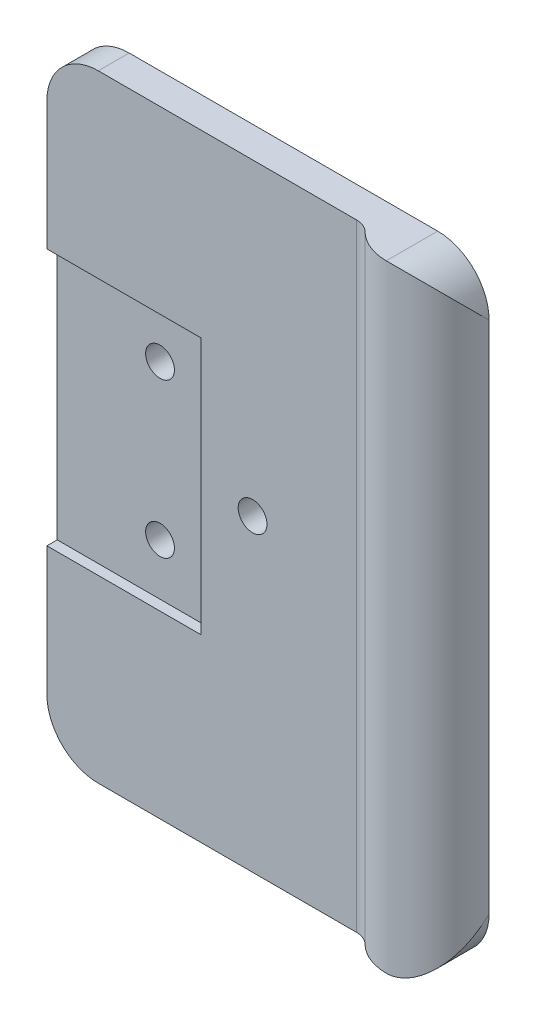
ISO-10303-21;
HEADER;
FILE_DESCRIPTION(('STEP AP214'),'2;1');
FILE_NAME('part.step','',(''),(''),'','','');
FILE_SCHEMA(('AUTOMOTIVE_DESIGN { 1 0 10303 214 1 1 1 1 }'));
ENDSEC;
DATA;
#1=APPLICATION_CONTEXT('core data for automotive mechanical design processes');
#2=APPLICATION_PROTOCOL_DEFINITION('international standard','automotive_design',2000,#1);
#3=PRODUCT_CONTEXT('',#1,'mechanical');
#4=PRODUCT('Part','Part','',(#3));
#5=PRODUCT_RELATED_PRODUCT_CATEGORY('part','',(#4));
#6=PRODUCT_DEFINITION_FORMATION('','',#4);
#7=PRODUCT_DEFINITION_CONTEXT('part definition',#1,'design');
#8=PRODUCT_DEFINITION('design','',#6,#7);
#9=PRODUCT_DEFINITION_SHAPE('','',#8);
#10=(LENGTH_UNIT() NAMED_UNIT(*) SI_UNIT(.MILLI.,.METRE.));
#11=(NAMED_UNIT(*) PLANE_ANGLE_UNIT() SI_UNIT($,.RADIAN.));
#12=(NAMED_UNIT(*) SI_UNIT($,.STERADIAN.) SOLID_ANGLE_UNIT());
#13=UNCERTAINTY_MEASURE_WITH_UNIT(LENGTH_MEASURE(1.E-05),#10,'distance_accuracy_value','');
#14=(GEOMETRIC_REPRESENTATION_CONTEXT(3) GLOBAL_UNCERTAINTY_ASSIGNED_CONTEXT((#13)) GLOBAL_UNIT_ASSIGNED_CONTEXT((#10,
#11,#12)) REPRESENTATION_CONTEXT('',''));
#15=CARTESIAN_POINT('',(0.,0.,0.));
#16=DIRECTION('',(0.,0.,1.));
#17=DIRECTION('',(1.,0.,0.));
#18=AXIS2_PLACEMENT_3D('',#15,#16,#17);
#19=CARTESIAN_POINT('',(0.,0.,-3.));
#20=DIRECTION('',(0.,0.,-1.));
#21=DIRECTION('',(-1.,0.,0.));
#22=AXIS2_PLACEMENT_3D('',#19,#20,#21);
#23=PLANE('',#22);
#24=CARTESIAN_POINT('',(-55.9850692997892,4.30643440303937,-3.));
#25=DIRECTION('',(0.,0.,1.));
#26=DIRECTION('',(1.,0.,0.));
#27=AXIS2_PLACEMENT_3D('',#24,#25,#26);
#28=CIRCLE('',#27,1.4);
#29=CARTESIAN_POINT('',(-54.5850692997892,4.30643440303937,-3.));
#30=VERTEX_POINT('',#29);
#31=EDGE_CURVE('E165',#30,#30,#28,.T.);
#32=ORIENTED_EDGE('',*,*,#31,.T.);
#33=EDGE_LOOP('',(#32));
#34=FACE_BOUND('',#33,.T.);
#35=CARTESIAN_POINT('',(-55.9850692997892,-10.6935655969606,-3.));
#36=DIRECTION('',(0.,0.,1.));
#37=DIRECTION('',(1.,0.,0.));
#38=AXIS2_PLACEMENT_3D('',#35,#36,#37);
#39=CIRCLE('',#38,1.4);
#40=CARTESIAN_POINT('',(-54.5850692997892,-10.6935655969606,-3.));
#41=VERTEX_POINT('',#40);
#42=EDGE_CURVE('E171',#41,#41,#39,.T.);
#43=ORIENTED_EDGE('',*,*,#42,.T.);
#44=EDGE_LOOP('',(#43));
#45=FACE_BOUND('',#44,.T.);
#46=CARTESIAN_POINT('',(-45.9850692997892,-3.19356559696063,-3.));
#47=DIRECTION('',(0.,0.,1.));
#48=DIRECTION('',(1.,0.,0.));
#49=AXIS2_PLACEMENT_3D('',#46,#47,#48);
#50=CIRCLE('',#49,1.4);
#51=CARTESIAN_POINT('',(-44.5850692997892,-3.19356559696063,-3.));
#52=VERTEX_POINT('',#51);
#53=EDGE_CURVE('E177',#52,#52,#50,.T.);
#54=ORIENTED_EDGE('',*,*,#53,.T.);
#55=EDGE_LOOP('',(#54));
#56=FACE_BOUND('',#55,.T.);
#57=DIRECTION('',(1.,0.,0.));
#58=VECTOR('',#57,1.);
#59=CARTESIAN_POINT('',(-65.9850692997892,26.8064344030394,-3.));
#60=LINE('',#59,#58);
#61=CARTESIAN_POINT('',(-60.9850692997892,26.8064344030394,-3.));
#62=VERTEX_POINT('',#61);
#63=CARTESIAN_POINT('',(-30.9850692997892,26.8064344030394,-3.));
#64=VERTEX_POINT('',#63);
#65=EDGE_CURVE('E131',#62,#64,#60,.T.);
#66=ORIENTED_EDGE('',*,*,#65,.T.);
#67=CARTESIAN_POINT('',(-30.9850692997892,21.8064344030393,-3.));
#68=DIRECTION('',(0.,0.,-1.));
#69=DIRECTION('',(1.,0.,0.));
#70=AXIS2_PLACEMENT_3D('',#67,#68,#69);
#71=CIRCLE('',#70,5.);
#72=CARTESIAN_POINT('',(-25.9850692997892,21.8064344030393,-3.));
#73=VERTEX_POINT('',#72);
#74=EDGE_CURVE('E135',#64,#73,#71,.T.);
#75=ORIENTED_EDGE('',*,*,#74,.T.);
#76=DIRECTION('',(0.,-1.,0.));
#77=VECTOR('',#76,1.);
#78=CARTESIAN_POINT('',(-25.9850692997892,26.8064344030394,-3.));
#79=LINE('',#78,#77);
#80=CARTESIAN_POINT('',(-25.9850692997892,-28.1935655969606,-3.));
#81=VERTEX_POINT('',#80);
#82=EDGE_CURVE('E141',#73,#81,#79,.T.);
#83=ORIENTED_EDGE('',*,*,#82,.T.);
#84=CARTESIAN_POINT('',(-30.9850692997892,-28.1935655969606,-3.));
#85=DIRECTION('',(0.,0.,-1.));
#86=DIRECTION('',(1.,0.,0.));
#87=AXIS2_PLACEMENT_3D('',#84,#85,#86);
#88=CIRCLE('',#87,5.);
#89=CARTESIAN_POINT('',(-30.9850692997893,-33.1935655969606,-3.));
#90=VERTEX_POINT('',#89);
#91=EDGE_CURVE('E152',#81,#90,#88,.T.);
#92=ORIENTED_EDGE('',*,*,#91,.T.);
#93=DIRECTION('',(-1.,0.,0.));
#94=VECTOR('',#93,1.);
#95=CARTESIAN_POINT('',(-25.9850692997892,-33.1935655969606,-3.));
#96=LINE('',#95,#94);
#97=CARTESIAN_POINT('',(-60.9850692997892,-33.1935655969606,-3.));
#98=VERTEX_POINT('',#97);
#99=EDGE_CURVE('E220',#90,#98,#96,.T.);
#100=ORIENTED_EDGE('',*,*,#99,.T.);
#101=CARTESIAN_POINT('',(-60.9850692997892,-28.1935655969606,-3.));
#102=DIRECTION('',(0.,0.,-1.));
#103=DIRECTION('',(-1.,0.,0.));
#104=AXIS2_PLACEMENT_3D('',#101,#102,#103);
#105=CIRCLE('',#104,5.);
#106=CARTESIAN_POINT('',(-65.9850692997892,-28.1935655969606,-3.));
#107=VERTEX_POINT('',#106);
#108=EDGE_CURVE('E226',#98,#107,#105,.T.);
#109=ORIENTED_EDGE('',*,*,#108,.T.);
#110=DIRECTION('',(0.,1.,0.));
#111=VECTOR('',#110,1.);
#112=CARTESIAN_POINT('',(-65.9850692997892,-33.1935655969606,-3.));
#113=LINE('',#112,#111);
#114=CARTESIAN_POINT('',(-65.9850692997892,21.8064344030393,-3.));
#115=VERTEX_POINT('',#114);
#116=EDGE_CURVE('E142',#107,#115,#113,.T.);
#117=ORIENTED_EDGE('',*,*,#116,.T.);
#118=CARTESIAN_POINT('',(-60.9850692997892,21.8064344030393,-3.));
#119=DIRECTION('',(0.,0.,-1.));
#120=DIRECTION('',(-1.,0.,0.));
#121=AXIS2_PLACEMENT_3D('',#118,#119,#120);
#122=CIRCLE('',#121,5.);
#123=EDGE_CURVE('E138',#115,#62,#122,.T.);
#124=ORIENTED_EDGE('',*,*,#123,.T.);
#125=EDGE_LOOP('',(#66,#75,#83,#92,#100,#109,#117,#124));
#126=FACE_BOUND('',#125,.T.);
#127=ADVANCED_FACE('F37',(#34,#45,#56,#126),#23,.T.);
#128=CARTESIAN_POINT('',(-30.9850692997892,36.5,-3.));
#129=DIRECTION('',(0.,-1.,0.));
#130=DIRECTION('',(0.,0.,-1.));
#131=AXIS2_PLACEMENT_3D('',#128,#129,#130);
#132=CYLINDRICAL_SURFACE('',#131,5.);
#133=CARTESIAN_POINT('',(-30.9850692997892,26.8064344030394,-3.));
#134=DIRECTION('',(0.,1.,0.));
#135=DIRECTION('',(0.,0.,1.));
#136=AXIS2_PLACEMENT_3D('',#133,#134,#135);
#137=CIRCLE('',#136,5.);
#138=CARTESIAN_POINT('',(-34.4843403609081,26.8064344030394,0.571428571428572));
#139=VERTEX_POINT('',#138);
#140=CARTESIAN_POINT('',(-30.9850692997892,26.8064344030394,2.));
#141=VERTEX_POINT('',#140);
#142=EDGE_CURVE('E148',#139,#141,#137,.T.);
#143=ORIENTED_EDGE('',*,*,#142,.F.);
#144=DIRECTION('',(0.,-1.,0.));
#145=VECTOR('',#144,1.);
#146=CARTESIAN_POINT('',(-34.4843403609081,36.5,0.571428571428572));
#147=LINE('',#146,#145);
#148=CARTESIAN_POINT('',(-34.4843403609081,-33.1935655969606,0.571428571428572));
#149=VERTEX_POINT('',#148);
#150=EDGE_CURVE('E245',#139,#149,#147,.T.);
#151=ORIENTED_EDGE('',*,*,#150,.T.);
#152=CARTESIAN_POINT('',(-30.9850692997892,-33.1935655969606,-3.));
#153=DIRECTION('',(0.,-1.,0.));
#154=DIRECTION('',(0.,0.,-1.));
#155=AXIS2_PLACEMENT_3D('',#152,#153,#154);
#156=CIRCLE('',#155,5.);
#157=CARTESIAN_POINT('',(-30.9850692997893,-33.1935655969606,2.));
#158=VERTEX_POINT('',#157);
#159=EDGE_CURVE('E239',#158,#149,#156,.T.);
#160=ORIENTED_EDGE('',*,*,#159,.F.);
#161=CARTESIAN_POINT('',(-30.9850692997892,-28.1935655969606,-3.));
#162=DIRECTION('',(0.,-0.707106781186547,-0.707106781186547));
#163=DIRECTION('',(0.,-0.707106781186547,0.707106781186547));
#164=AXIS2_PLACEMENT_3D('',#161,#162,#163);
#165=ELLIPSE('',#164,7.07106781186547,5.);
#166=EDGE_CURVE('E241',#81,#158,#165,.T.);
#167=ORIENTED_EDGE('',*,*,#166,.F.);
#168=ORIENTED_EDGE('',*,*,#82,.F.);
#169=CARTESIAN_POINT('',(-30.9850692997892,21.8064344030393,-3.));
#170=DIRECTION('',(0.,-0.707106781186547,0.707106781186547));
#171=DIRECTION('',(0.,-0.707106781186547,-0.707106781186547));
#172=AXIS2_PLACEMENT_3D('',#169,#170,#171);
#173=ELLIPSE('',#172,7.07106781186548,5.);
#174=EDGE_CURVE('E155',#141,#73,#173,.F.);
#175=ORIENTED_EDGE('',*,*,#174,.F.);
#176=EDGE_LOOP('',(#143,#151,#160,#167,#168,#175));
#177=FACE_BOUND('',#176,.T.);
#178=ADVANCED_FACE('F251',(#177),#132,.T.);
#179=CARTESIAN_POINT('',(-25.9850692997892,-33.1935655969606,0.));
#180=DIRECTION('',(0.,-1.,0.));
#181=DIRECTION('',(0.,0.,-1.));
#182=AXIS2_PLACEMENT_3D('',#179,#180,#181);
#183=PLANE('',#182);
#184=ORIENTED_EDGE('',*,*,#99,.F.);
#185=DIRECTION('',(0.,0.,-1.));
#186=VECTOR('',#185,1.);
#187=CARTESIAN_POINT('',(-30.9850692997893,-33.1935655969606,123.));
#188=LINE('',#187,#186);
#189=EDGE_CURVE('E151',#158,#90,#188,.T.);
#190=ORIENTED_EDGE('',*,*,#189,.F.);
#191=ORIENTED_EDGE('',*,*,#159,.T.);
#192=CARTESIAN_POINT('',(-35.8840487853556,-33.1935655969606,2.));
#193=DIRECTION('',(0.,-1.,0.));
#194=DIRECTION('',(0.,0.,-1.));
#195=AXIS2_PLACEMENT_3D('',#192,#193,#194);
#196=CIRCLE('',#195,2.);
#197=CARTESIAN_POINT('',(-35.8840487853556,-33.1935655969606,0.));
#198=VERTEX_POINT('',#197);
#199=EDGE_CURVE('E45',#149,#198,#196,.F.);
#200=ORIENTED_EDGE('',*,*,#199,.T.);
#201=DIRECTION('',(-1.,0.,0.));
#202=VECTOR('',#201,1.);
#203=CARTESIAN_POINT('',(-25.9850692997892,-33.1935655969606,0.));
#204=LINE('',#203,#202);
#205=CARTESIAN_POINT('',(-60.9850692997892,-33.1935655969606,0.));
#206=VERTEX_POINT('',#205);
#207=EDGE_CURVE('E215',#198,#206,#204,.T.);
#208=ORIENTED_EDGE('',*,*,#207,.T.);
#209=DIRECTION('',(0.,0.,-1.));
#210=VECTOR('',#209,1.);
#211=CARTESIAN_POINT('',(-60.9850692997892,-33.1935655969606,0.));
#212=LINE('',#211,#210);
#213=EDGE_CURVE('E236',#206,#98,#212,.T.);
#214=ORIENTED_EDGE('',*,*,#213,.T.);
#215=EDGE_LOOP('',(#184,#190,#191,#200,#208,#214));
#216=FACE_BOUND('',#215,.T.);
#217=ADVANCED_FACE('F256',(#216),#183,.T.);
#218=CARTESIAN_POINT('',(-65.9850692997892,26.8064344030394,0.));
#219=DIRECTION('',(0.,1.,0.));
#220=DIRECTION('',(0.,0.,1.));
#221=AXIS2_PLACEMENT_3D('',#218,#219,#220);
#222=PLANE('',#221);
#223=DIRECTION('',(1.,0.,0.));
#224=VECTOR('',#223,1.);
#225=CARTESIAN_POINT('',(-65.9850692997892,26.8064344030394,0.));
#226=LINE('',#225,#224);
#227=CARTESIAN_POINT('',(-60.9850692997892,26.8064344030394,0.));
#228=VERTEX_POINT('',#227);
#229=CARTESIAN_POINT('',(-35.8840487853556,26.8064344030394,0.));
#230=VERTEX_POINT('',#229);
#231=EDGE_CURVE('E212',#228,#230,#226,.T.);
#232=ORIENTED_EDGE('',*,*,#231,.T.);
#233=CARTESIAN_POINT('',(-35.8840487853556,26.8064344030394,2.));
#234=DIRECTION('',(0.,1.,0.));
#235=DIRECTION('',(0.,0.,1.));
#236=AXIS2_PLACEMENT_3D('',#233,#234,#235);
#237=CIRCLE('',#236,2.);
#238=EDGE_CURVE('E11',#230,#139,#237,.F.);
#239=ORIENTED_EDGE('',*,*,#238,.T.);
#240=ORIENTED_EDGE('',*,*,#142,.T.);
#241=DIRECTION('',(0.,0.,-1.));
#242=VECTOR('',#241,1.);
#243=CARTESIAN_POINT('',(-30.9850692997892,26.8064344030394,123.));
#244=LINE('',#243,#242);
#245=EDGE_CURVE('E145',#141,#64,#244,.T.);
#246=ORIENTED_EDGE('',*,*,#245,.T.);
#247=ORIENTED_EDGE('',*,*,#65,.F.);
#248=DIRECTION('',(0.,0.,-1.));
#249=VECTOR('',#248,1.);
#250=CARTESIAN_POINT('',(-60.9850692997892,26.8064344030394,0.));
#251=LINE('',#250,#249);
#252=EDGE_CURVE('E229',#62,#228,#251,.F.);
#253=ORIENTED_EDGE('',*,*,#252,.T.);
#254=EDGE_LOOP('',(#232,#239,#240,#246,#247,#253));
#255=FACE_BOUND('',#254,.T.);
#256=ADVANCED_FACE('F146',(#255),#222,.T.);
#257=CARTESIAN_POINT('',(0.,0.,0.));
#258=DIRECTION('',(0.,0.,-1.));
#259=DIRECTION('',(-1.,0.,0.));
#260=AXIS2_PLACEMENT_3D('',#257,#258,#259);
#261=PLANE('',#260);
#262=CARTESIAN_POINT('',(-45.9850692997892,-3.19356559696063,0.));
#263=DIRECTION('',(0.,0.,1.));
#264=DIRECTION('',(1.,0.,0.));
#265=AXIS2_PLACEMENT_3D('',#262,#263,#264);
#266=CIRCLE('',#265,1.4);
#267=CARTESIAN_POINT('',(-44.5850692997892,-3.19356559696063,0.));
#268=VERTEX_POINT('',#267);
#269=EDGE_CURVE('E174',#268,#268,#266,.T.);
#270=ORIENTED_EDGE('',*,*,#269,.F.);
#271=EDGE_LOOP('',(#270));
#272=FACE_BOUND('',#271,.T.);
#273=ORIENTED_EDGE('',*,*,#207,.F.);
#274=DIRECTION('',(0.,1.,0.));
#275=VECTOR('',#274,1.);
#276=CARTESIAN_POINT('',(-35.8840487853556,26.8064344030394,0.));
#277=LINE('',#276,#275);
#278=EDGE_CURVE('E58',#198,#230,#277,.T.);
#279=ORIENTED_EDGE('',*,*,#278,.T.);
#280=ORIENTED_EDGE('',*,*,#231,.F.);
#281=CARTESIAN_POINT('',(-60.9850692997892,21.8064344030393,0.));
#282=DIRECTION('',(0.,0.,-1.));
#283=DIRECTION('',(-1.,0.,0.));
#284=AXIS2_PLACEMENT_3D('',#281,#282,#283);
#285=CIRCLE('',#284,5.);
#286=CARTESIAN_POINT('',(-65.9850692997892,21.8064344030393,0.));
#287=VERTEX_POINT('',#286);
#288=EDGE_CURVE('E234',#228,#287,#285,.F.);
#289=ORIENTED_EDGE('',*,*,#288,.T.);
#290=DIRECTION('',(0.,1.,0.));
#291=VECTOR('',#290,1.);
#292=CARTESIAN_POINT('',(-65.9850692997892,-33.1935655969606,0.));
#293=LINE('',#292,#291);
#294=CARTESIAN_POINT('',(-65.9850692997892,9.30643440303937,0.));
#295=VERTEX_POINT('',#294);
#296=EDGE_CURVE('E213',#295,#287,#293,.T.);
#297=ORIENTED_EDGE('',*,*,#296,.F.);
#298=DIRECTION('',(-1.,0.,0.));
#299=VECTOR('',#298,1.);
#300=CARTESIAN_POINT('',(-50.9850692997892,9.30643440303937,0.));
#301=LINE('',#300,#299);
#302=CARTESIAN_POINT('',(-50.9850692997892,9.30643440303937,0.));
#303=VERTEX_POINT('',#302);
#304=EDGE_CURVE('E185',#303,#295,#301,.T.);
#305=ORIENTED_EDGE('',*,*,#304,.F.);
#306=DIRECTION('',(0.,1.,0.));
#307=VECTOR('',#306,1.);
#308=CARTESIAN_POINT('',(-50.9850692997892,-15.6935655969607,0.));
#309=LINE('',#308,#307);
#310=CARTESIAN_POINT('',(-50.9850692997892,-15.6935655969607,0.));
#311=VERTEX_POINT('',#310);
#312=EDGE_CURVE('E197',#311,#303,#309,.T.);
#313=ORIENTED_EDGE('',*,*,#312,.F.);
#314=DIRECTION('',(1.,0.,0.));
#315=VECTOR('',#314,1.);
#316=CARTESIAN_POINT('',(-65.9850692997892,-15.6935655969607,0.));
#317=LINE('',#316,#315);
#318=CARTESIAN_POINT('',(-65.9850692997892,-15.6935655969607,0.));
#319=VERTEX_POINT('',#318);
#320=EDGE_CURVE('E180',#319,#311,#317,.T.);
#321=ORIENTED_EDGE('',*,*,#320,.F.);
#322=CARTESIAN_POINT('',(-65.9850692997892,-28.1935655969606,0.));
#323=VERTEX_POINT('',#322);
#324=EDGE_CURVE('E210',#323,#319,#293,.T.);
#325=ORIENTED_EDGE('',*,*,#324,.F.);
#326=CARTESIAN_POINT('',(-60.9850692997892,-28.1935655969606,0.));
#327=DIRECTION('',(0.,0.,-1.));
#328=DIRECTION('',(-1.,0.,0.));
#329=AXIS2_PLACEMENT_3D('',#326,#327,#328);
#330=CIRCLE('',#329,5.);
#331=EDGE_CURVE('E231',#323,#206,#330,.F.);
#332=ORIENTED_EDGE('',*,*,#331,.T.);
#333=EDGE_LOOP('',(#273,#279,#280,#289,#297,#305,#313,#321,#325,#332));
#334=FACE_BOUND('',#333,.T.);
#335=ADVANCED_FACE('F267',(#272,#334),#261,.F.);
#336=CARTESIAN_POINT('',(-65.9850692997892,-33.1935655969606,0.));
#337=DIRECTION('',(-1.,0.,0.));
#338=DIRECTION('',(0.,-1.,0.));
#339=AXIS2_PLACEMENT_3D('',#336,#337,#338);
#340=PLANE('',#339);
#341=ORIENTED_EDGE('',*,*,#296,.T.);
#342=DIRECTION('',(0.,0.,-1.));
#343=VECTOR('',#342,1.);
#344=CARTESIAN_POINT('',(-65.9850692997892,21.8064344030393,0.));
#345=LINE('',#344,#343);
#346=EDGE_CURVE('E223',#287,#115,#345,.T.);
#347=ORIENTED_EDGE('',*,*,#346,.T.);
#348=ORIENTED_EDGE('',*,*,#116,.F.);
#349=DIRECTION('',(0.,0.,-1.));
#350=VECTOR('',#349,1.);
#351=CARTESIAN_POINT('',(-65.9850692997892,-28.1935655969606,0.));
#352=LINE('',#351,#350);
#353=EDGE_CURVE('E217',#107,#323,#352,.F.);
#354=ORIENTED_EDGE('',*,*,#353,.T.);
#355=ORIENTED_EDGE('',*,*,#324,.T.);
#356=DIRECTION('',(0.,0.,1.));
#357=VECTOR('',#356,1.);
#358=CARTESIAN_POINT('',(-65.9850692997892,-15.6935655969607,-1.));
#359=LINE('',#358,#357);
#360=CARTESIAN_POINT('',(-65.9850692997892,-15.6935655969607,-1.));
#361=VERTEX_POINT('',#360);
#362=EDGE_CURVE('E194',#361,#319,#359,.T.);
#363=ORIENTED_EDGE('',*,*,#362,.F.);
#364=DIRECTION('',(0.,-1.,0.));
#365=VECTOR('',#364,1.);
#366=CARTESIAN_POINT('',(-65.9850692997892,9.30643440303937,-1.));
#367=LINE('',#366,#365);
#368=CARTESIAN_POINT('',(-65.9850692997892,9.30643440303937,-1.));
#369=VERTEX_POINT('',#368);
#370=EDGE_CURVE('E181',#369,#361,#367,.T.);
#371=ORIENTED_EDGE('',*,*,#370,.F.);
#372=DIRECTION('',(0.,0.,1.));
#373=VECTOR('',#372,1.);
#374=CARTESIAN_POINT('',(-65.9850692997892,9.30643440303937,-1.));
#375=LINE('',#374,#373);
#376=EDGE_CURVE('E201',#369,#295,#375,.T.);
#377=ORIENTED_EDGE('',*,*,#376,.T.);
#378=EDGE_LOOP('',(#341,#347,#348,#354,#355,#363,#371,#377));
#379=FACE_BOUND('',#378,.T.);
#380=ADVANCED_FACE('F273',(#379),#340,.T.);
#381=CARTESIAN_POINT('',(-50.9850692997892,9.30643440303937,-1.));
#382=DIRECTION('',(0.,1.,0.));
#383=DIRECTION('',(0.,0.,1.));
#384=AXIS2_PLACEMENT_3D('',#381,#382,#383);
#385=PLANE('',#384);
#386=ORIENTED_EDGE('',*,*,#304,.T.);
#387=ORIENTED_EDGE('',*,*,#376,.F.);
#388=DIRECTION('',(-1.,0.,0.));
#389=VECTOR('',#388,1.);
#390=CARTESIAN_POINT('',(-50.9850692997892,9.30643440303937,-1.));
#391=LINE('',#390,#389);
#392=CARTESIAN_POINT('',(-50.9850692997892,9.30643440303937,-1.));
#393=VERTEX_POINT('',#392);
#394=EDGE_CURVE('E191',#393,#369,#391,.T.);
#395=ORIENTED_EDGE('',*,*,#394,.F.);
#396=DIRECTION('',(0.,0.,1.));
#397=VECTOR('',#396,1.);
#398=CARTESIAN_POINT('',(-50.9850692997892,9.30643440303937,-1.));
#399=LINE('',#398,#397);
#400=EDGE_CURVE('E204',#393,#303,#399,.T.);
#401=ORIENTED_EDGE('',*,*,#400,.T.);
#402=EDGE_LOOP('',(#386,#387,#395,#401));
#403=FACE_BOUND('',#402,.T.);
#404=ADVANCED_FACE('F310',(#403),#385,.F.);
#405=CARTESIAN_POINT('',(-50.9850692997892,-15.6935655969607,-1.));
#406=DIRECTION('',(1.,0.,0.));
#407=DIRECTION('',(0.,0.,-1.));
#408=AXIS2_PLACEMENT_3D('',#405,#406,#407);
#409=PLANE('',#408);
#410=ORIENTED_EDGE('',*,*,#312,.T.);
#411=ORIENTED_EDGE('',*,*,#400,.F.);
#412=DIRECTION('',(0.,1.,0.));
#413=VECTOR('',#412,1.);
#414=CARTESIAN_POINT('',(-50.9850692997892,-15.6935655969607,-1.));
#415=LINE('',#414,#413);
#416=CARTESIAN_POINT('',(-50.9850692997892,-15.6935655969607,-1.));
#417=VERTEX_POINT('',#416);
#418=EDGE_CURVE('E188',#417,#393,#415,.T.);
#419=ORIENTED_EDGE('',*,*,#418,.F.);
#420=DIRECTION('',(0.,0.,1.));
#421=VECTOR('',#420,1.);
#422=CARTESIAN_POINT('',(-50.9850692997892,-15.6935655969607,-1.));
#423=LINE('',#422,#421);
#424=EDGE_CURVE('E206',#417,#311,#423,.T.);
#425=ORIENTED_EDGE('',*,*,#424,.T.);
#426=EDGE_LOOP('',(#410,#411,#419,#425));
#427=FACE_BOUND('',#426,.T.);
#428=ADVANCED_FACE('F337',(#427),#409,.F.);
#429=CARTESIAN_POINT('',(-65.9850692997892,-15.6935655969607,-1.));
#430=DIRECTION('',(0.,-1.,0.));
#431=DIRECTION('',(0.,0.,-1.));
#432=AXIS2_PLACEMENT_3D('',#429,#430,#431);
#433=PLANE('',#432);
#434=ORIENTED_EDGE('',*,*,#320,.T.);
#435=ORIENTED_EDGE('',*,*,#424,.F.);
#436=DIRECTION('',(1.,0.,0.));
#437=VECTOR('',#436,1.);
#438=CARTESIAN_POINT('',(-65.9850692997892,-15.6935655969607,-1.));
#439=LINE('',#438,#437);
#440=EDGE_CURVE('E184',#361,#417,#439,.T.);
#441=ORIENTED_EDGE('',*,*,#440,.F.);
#442=ORIENTED_EDGE('',*,*,#362,.T.);
#443=EDGE_LOOP('',(#434,#435,#441,#442));
#444=FACE_BOUND('',#443,.T.);
#445=ADVANCED_FACE('F276',(#444),#433,.F.);
#446=CARTESIAN_POINT('',(0.,0.,-1.));
#447=DIRECTION('',(0.,0.,1.));
#448=DIRECTION('',(1.,0.,0.));
#449=AXIS2_PLACEMENT_3D('',#446,#447,#448);
#450=PLANE('',#449);
#451=CARTESIAN_POINT('',(-55.9850692997892,4.30643440303937,-1.));
#452=DIRECTION('',(0.,0.,1.));
#453=DIRECTION('',(1.,0.,0.));
#454=AXIS2_PLACEMENT_3D('',#451,#452,#453);
#455=CIRCLE('',#454,1.4);
#456=CARTESIAN_POINT('',(-54.5850692997892,4.30643440303937,-1.));
#457=VERTEX_POINT('',#456);
#458=EDGE_CURVE('E161',#457,#457,#455,.T.);
#459=ORIENTED_EDGE('',*,*,#458,.F.);
#460=EDGE_LOOP('',(#459));
#461=FACE_BOUND('',#460,.T.);
#462=CARTESIAN_POINT('',(-55.9850692997892,-10.6935655969606,-1.));
#463=DIRECTION('',(0.,0.,1.));
#464=DIRECTION('',(1.,0.,0.));
#465=AXIS2_PLACEMENT_3D('',#462,#463,#464);
#466=CIRCLE('',#465,1.4);
#467=CARTESIAN_POINT('',(-54.5850692997892,-10.6935655969606,-1.));
#468=VERTEX_POINT('',#467);
#469=EDGE_CURVE('E168',#468,#468,#466,.T.);
#470=ORIENTED_EDGE('',*,*,#469,.F.);
#471=EDGE_LOOP('',(#470));
#472=FACE_BOUND('',#471,.T.);
#473=ORIENTED_EDGE('',*,*,#370,.T.);
#474=ORIENTED_EDGE('',*,*,#440,.T.);
#475=ORIENTED_EDGE('',*,*,#418,.T.);
#476=ORIENTED_EDGE('',*,*,#394,.T.);
#477=EDGE_LOOP('',(#473,#474,#475,#476));
#478=FACE_BOUND('',#477,.T.);
#479=ADVANCED_FACE('F279',(#461,#472,#478),#450,.T.);
#480=CARTESIAN_POINT('',(-45.9850692997892,-3.19356559696063,0.));
#481=DIRECTION('',(0.,0.,1.));
#482=DIRECTION('',(1.,0.,0.));
#483=AXIS2_PLACEMENT_3D('',#480,#481,#482);
#484=CYLINDRICAL_SURFACE('',#483,1.4);
#485=ORIENTED_EDGE('',*,*,#53,.F.);
#486=EDGE_LOOP('',(#485));
#487=FACE_BOUND('',#486,.T.);
#488=ORIENTED_EDGE('',*,*,#269,.T.);
#489=EDGE_LOOP('',(#488));
#490=FACE_BOUND('',#489,.T.);
#491=ADVANCED_FACE('F327',(#487,#490),#484,.F.);
#492=CARTESIAN_POINT('',(-55.9850692997892,-10.6935655969606,-1.));
#493=DIRECTION('',(0.,0.,1.));
#494=DIRECTION('',(1.,0.,0.));
#495=AXIS2_PLACEMENT_3D('',#492,#493,#494);
#496=CYLINDRICAL_SURFACE('',#495,1.4);
#497=ORIENTED_EDGE('',*,*,#42,.F.);
#498=EDGE_LOOP('',(#497));
#499=FACE_BOUND('',#498,.T.);
#500=ORIENTED_EDGE('',*,*,#469,.T.);
#501=EDGE_LOOP('',(#500));
#502=FACE_BOUND('',#501,.T.);
#503=ADVANCED_FACE('F323',(#499,#502),#496,.F.);
#504=CARTESIAN_POINT('',(-55.9850692997892,4.30643440303937,-1.));
#505=DIRECTION('',(0.,0.,1.));
#506=DIRECTION('',(1.,0.,0.));
#507=AXIS2_PLACEMENT_3D('',#504,#505,#506);
#508=CYLINDRICAL_SURFACE('',#507,1.4);
#509=ORIENTED_EDGE('',*,*,#31,.F.);
#510=EDGE_LOOP('',(#509));
#511=FACE_BOUND('',#510,.T.);
#512=ORIENTED_EDGE('',*,*,#458,.T.);
#513=EDGE_LOOP('',(#512));
#514=FACE_BOUND('',#513,.T.);
#515=ADVANCED_FACE('F312',(#511,#514),#508,.F.);
#516=CARTESIAN_POINT('',(-60.9850692997892,21.8064344030393,0.));
#517=DIRECTION('',(0.,0.,-1.));
#518=DIRECTION('',(-1.,0.,0.));
#519=AXIS2_PLACEMENT_3D('',#516,#517,#518);
#520=CYLINDRICAL_SURFACE('',#519,5.);
#521=ORIENTED_EDGE('',*,*,#288,.F.);
#522=ORIENTED_EDGE('',*,*,#252,.F.);
#523=ORIENTED_EDGE('',*,*,#123,.F.);
#524=ORIENTED_EDGE('',*,*,#346,.F.);
#525=EDGE_LOOP('',(#521,#522,#523,#524));
#526=FACE_BOUND('',#525,.T.);
#527=ADVANCED_FACE('F287',(#526),#520,.T.);
#528=CARTESIAN_POINT('',(-60.9850692997892,-28.1935655969606,0.));
#529=DIRECTION('',(0.,0.,-1.));
#530=DIRECTION('',(-1.,0.,0.));
#531=AXIS2_PLACEMENT_3D('',#528,#529,#530);
#532=CYLINDRICAL_SURFACE('',#531,5.);
#533=ORIENTED_EDGE('',*,*,#331,.F.);
#534=ORIENTED_EDGE('',*,*,#353,.F.);
#535=ORIENTED_EDGE('',*,*,#108,.F.);
#536=ORIENTED_EDGE('',*,*,#213,.F.);
#537=EDGE_LOOP('',(#533,#534,#535,#536));
#538=FACE_BOUND('',#537,.T.);
#539=ADVANCED_FACE('F265',(#538),#532,.T.);
#540=CARTESIAN_POINT('',(-30.9850692997892,-28.1935655969606,123.));
#541=DIRECTION('',(0.,0.,-1.));
#542=DIRECTION('',(-1.,0.,0.));
#543=AXIS2_PLACEMENT_3D('',#540,#541,#542);
#544=CYLINDRICAL_SURFACE('',#543,5.);
#545=ORIENTED_EDGE('',*,*,#166,.T.);
#546=ORIENTED_EDGE('',*,*,#189,.T.);
#547=ORIENTED_EDGE('',*,*,#91,.F.);
#548=EDGE_LOOP('',(#545,#546,#547));
#549=FACE_BOUND('',#548,.T.);
#550=ADVANCED_FACE('F258',(#549),#544,.T.);
#551=CARTESIAN_POINT('',(-30.9850692997892,21.8064344030393,123.));
#552=DIRECTION('',(0.,0.,-1.));
#553=DIRECTION('',(-1.,0.,0.));
#554=AXIS2_PLACEMENT_3D('',#551,#552,#553);
#555=CYLINDRICAL_SURFACE('',#554,5.);
#556=ORIENTED_EDGE('',*,*,#174,.T.);
#557=ORIENTED_EDGE('',*,*,#74,.F.);
#558=ORIENTED_EDGE('',*,*,#245,.F.);
#559=EDGE_LOOP('',(#556,#557,#558));
#560=FACE_BOUND('',#559,.T.);
#561=ADVANCED_FACE('F154',(#560),#555,.T.);
#562=CARTESIAN_POINT('',(-35.8840487853556,36.5,2.));
#563=DIRECTION('',(0.,-1.,0.));
#564=DIRECTION('',(0.,0.,-1.));
#565=AXIS2_PLACEMENT_3D('',#562,#563,#564);
#566=CYLINDRICAL_SURFACE('',#565,2.);
#567=ORIENTED_EDGE('',*,*,#238,.F.);
#568=ORIENTED_EDGE('',*,*,#278,.F.);
#569=ORIENTED_EDGE('',*,*,#199,.F.);
#570=ORIENTED_EDGE('',*,*,#150,.F.);
#571=EDGE_LOOP('',(#567,#568,#569,#570));
#572=FACE_BOUND('',#571,.T.);
#573=ADVANCED_FACE('F39',(#572),#566,.F.);
#574=CLOSED_SHELL('',(#127,#178,#217,#256,#335,#380,#404,#428,#445,#479,#491,#503,#515,#527,
#539,#550,#561,#573));
#575=MANIFOLD_SOLID_BREP('B2',#574);
#576=ADVANCED_BREP_SHAPE_REPRESENTATION('',(#18,#575),#14);
#577=SHAPE_DEFINITION_REPRESENTATION(#9,#576);
ENDSEC;
END-ISO-10303-21;
